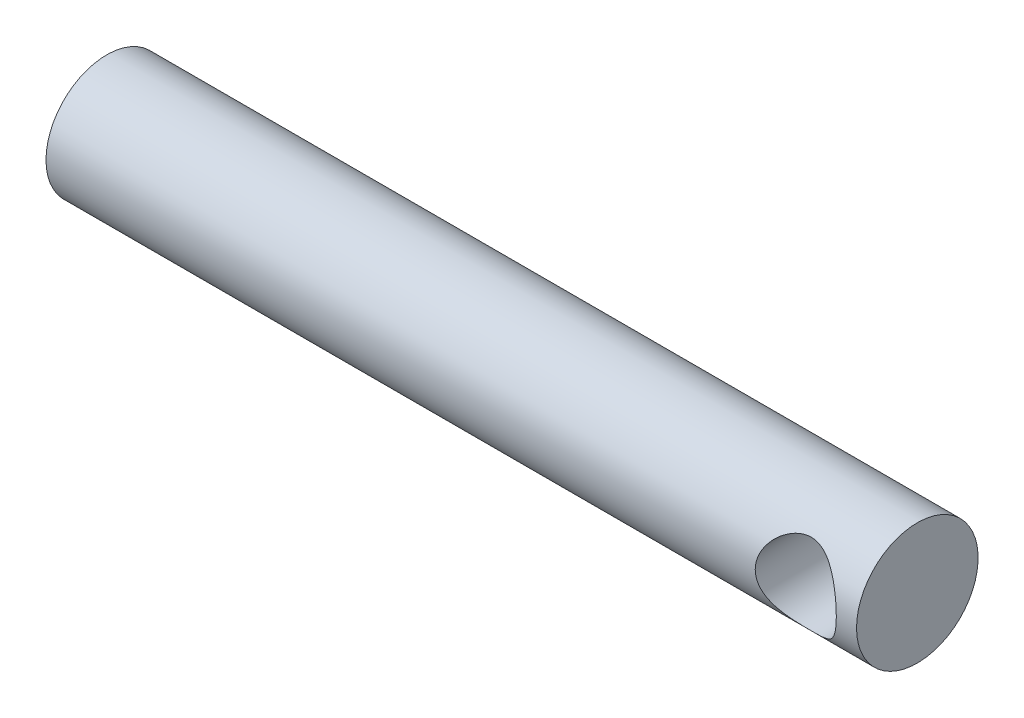
ISO-10303-21;
HEADER;
FILE_DESCRIPTION(('STEP AP214'),'2;1');
FILE_NAME('part.step','',(''),(''),'','','');
FILE_SCHEMA(('AUTOMOTIVE_DESIGN { 1 0 10303 214 1 1 1 1 }'));
ENDSEC;
DATA;
#1=APPLICATION_CONTEXT('core data for automotive mechanical design processes');
#2=APPLICATION_PROTOCOL_DEFINITION('international standard','automotive_design',2000,#1);
#3=PRODUCT_CONTEXT('',#1,'mechanical');
#4=PRODUCT('Part','Part','',(#3));
#5=PRODUCT_RELATED_PRODUCT_CATEGORY('part','',(#4));
#6=PRODUCT_DEFINITION_FORMATION('','',#4);
#7=PRODUCT_DEFINITION_CONTEXT('part definition',#1,'design');
#8=PRODUCT_DEFINITION('design','',#6,#7);
#9=PRODUCT_DEFINITION_SHAPE('','',#8);
#10=(LENGTH_UNIT() NAMED_UNIT(*) SI_UNIT(.MILLI.,.METRE.));
#11=(NAMED_UNIT(*) PLANE_ANGLE_UNIT() SI_UNIT($,.RADIAN.));
#12=(NAMED_UNIT(*) SI_UNIT($,.STERADIAN.) SOLID_ANGLE_UNIT());
#13=UNCERTAINTY_MEASURE_WITH_UNIT(LENGTH_MEASURE(1.E-05),#10,'distance_accuracy_value','');
#14=(GEOMETRIC_REPRESENTATION_CONTEXT(3) GLOBAL_UNCERTAINTY_ASSIGNED_CONTEXT((#13)) GLOBAL_UNIT_ASSIGNED_CONTEXT((#10,
#11,#12)) REPRESENTATION_CONTEXT('',''));
#15=CARTESIAN_POINT('',(0.,0.,0.));
#16=DIRECTION('',(0.,0.,1.));
#17=DIRECTION('',(1.,0.,0.));
#18=AXIS2_PLACEMENT_3D('',#15,#16,#17);
#19=CARTESIAN_POINT('',(-20.,0.,0.));
#20=DIRECTION('',(-1.,0.,0.));
#21=DIRECTION('',(0.,0.,1.));
#22=AXIS2_PLACEMENT_3D('',#19,#20,#21);
#23=CYLINDRICAL_SURFACE('',#22,3.);
#24=CARTESIAN_POINT('',(15.,0.,-3.));
#25=CARTESIAN_POINT('',(14.9999994503675,0.100484716668078,-3.0000004164484));
#26=CARTESIAN_POINT('',(15.0076139699555,0.200969087132902,-2.99490802753388));
#27=CARTESIAN_POINT('',(15.0375968641056,0.398733058031681,-2.97504652423809));
#28=CARTESIAN_POINT('',(15.0599722431233,0.496011113955008,-2.96027281581235));
#29=CARTESIAN_POINT('',(15.1181077173248,0.68421230785425,-2.92250482404708));
#30=CARTESIAN_POINT('',(15.1538051400079,0.775162872657556,-2.89954905493315));
#31=CARTESIAN_POINT('',(15.2370633632715,0.949415290997261,-2.8472613787744));
#32=CARTESIAN_POINT('',(15.2846258863005,1.03271603160967,-2.8179285460551));
#33=CARTESIAN_POINT('',(15.3946569373674,1.19728470077011,-2.75227329369838));
#34=CARTESIAN_POINT('',(15.4580478607429,1.27778030546068,-2.71556897579319));
#35=CARTESIAN_POINT('',(15.5957300486584,1.42772804469274,-2.63982313083466));
#36=CARTESIAN_POINT('',(15.6700369298377,1.49716405543888,-2.60077830356832));
#37=CARTESIAN_POINT('',(15.8410523676127,1.63422297745496,-2.51728264678794));
#38=CARTESIAN_POINT('',(15.9394456532034,1.6998318636275,-2.47295067937795));
#39=CARTESIAN_POINT('',(16.1483633776465,1.81350357014175,-2.3908414735282));
#40=CARTESIAN_POINT('',(16.2588664015627,1.86159673426503,-2.35305295954668));
#41=CARTESIAN_POINT('',(16.4567112934216,1.92674035011438,-2.2997626664146));
#42=CARTESIAN_POINT('',(16.5415284528739,1.94874447236008,-2.28097627892403));
#43=CARTESIAN_POINT('',(16.7147445047416,1.98150617785229,-2.25257969659604));
#44=CARTESIAN_POINT('',(16.803136948726,1.99228314651964,-2.24295368744147));
#45=CARTESIAN_POINT('',(16.9814747788564,2.00191364141228,-2.23436605608045));
#46=CARTESIAN_POINT('',(17.0714250234524,2.00071842917524,-2.23544802558502));
#47=CARTESIAN_POINT('',(17.2496349734997,1.98637581333356,-2.24819775483425));
#48=CARTESIAN_POINT('',(17.3378931820281,1.97321828380393,-2.25987448286881));
#49=CARTESIAN_POINT('',(17.5064670512419,1.93664994217326,-2.29127185989959));
#50=CARTESIAN_POINT('',(17.5869613359387,1.91371711479477,-2.31061488324375));
#51=CARTESIAN_POINT('',(17.7430236909758,1.85870118583424,-2.35509622933623));
#52=CARTESIAN_POINT('',(17.8185901302386,1.82661507328551,-2.3802364585489));
#53=CARTESIAN_POINT('',(17.9790253953564,1.74673818732649,-2.43964196377947));
#54=CARTESIAN_POINT('',(18.0626599004831,1.69708052300445,-2.47472317740626));
#55=CARTESIAN_POINT('',(18.2213833952857,1.58668960438221,-2.54691537733438));
#56=CARTESIAN_POINT('',(18.2964616577621,1.52594268999614,-2.58402882709328));
#57=CARTESIAN_POINT('',(18.4525425456034,1.37981165322309,-2.66543343763724));
#58=CARTESIAN_POINT('',(18.5313340486827,1.29193938283656,-2.7095474472056));
#59=CARTESIAN_POINT('',(18.6731964945385,1.10200799908008,-2.79218100665211));
#60=CARTESIAN_POINT('',(18.736282145409,0.999962299343699,-2.83070577648042));
#61=CARTESIAN_POINT('',(18.8334777186228,0.804857827096533,-2.89145404090364));
#62=CARTESIAN_POINT('',(18.8708433633389,0.713957643371913,-2.9153926116554));
#63=CARTESIAN_POINT('',(18.9321049256253,0.526036043935484,-2.95507719030499));
#64=CARTESIAN_POINT('',(18.9560122271322,0.429019879001653,-2.97083012127543));
#65=CARTESIAN_POINT('',(18.989161165238,0.230985453172283,-2.99275882156808));
#66=CARTESIAN_POINT('',(18.9983394609382,0.12995181193416,-2.99889322461187));
#67=CARTESIAN_POINT('',(19.0012470885622,-0.0724415193893449,-3.00083114965147));
#68=CARTESIAN_POINT('',(18.9949775004888,-0.173801186186624,-2.99663539385634));
#69=CARTESIAN_POINT('',(18.968375944438,-0.366455717204238,-2.97899589424273));
#70=CARTESIAN_POINT('',(18.9490627022448,-0.457957444679192,-2.96622246390226));
#71=CARTESIAN_POINT('',(18.8984043139871,-0.6361163924274,-2.93318449284837));
#72=CARTESIAN_POINT('',(18.8670572490718,-0.722772837571133,-2.91291875746989));
#73=CARTESIAN_POINT('',(18.7913477029551,-0.894664750465997,-2.86496352529158));
#74=CARTESIAN_POINT('',(18.7463118459181,-0.979496184631421,-2.83689870135785));
#75=CARTESIAN_POINT('',(18.6455667100537,-1.14068302395729,-2.77601855611511));
#76=CARTESIAN_POINT('',(18.5898508394678,-1.21703314820091,-2.74320030403941));
#77=CARTESIAN_POINT('',(18.4593921318425,-1.37185445482324,-2.6695454665343));
#78=CARTESIAN_POINT('',(18.3830337399249,-1.44875187569565,-2.62826156800165));
#79=CARTESIAN_POINT('',(18.2188885700429,-1.58933968069449,-2.54571173085957));
#80=CARTESIAN_POINT('',(18.1310939608925,-1.6530209365723,-2.50444582417845));
#81=CARTESIAN_POINT('',(17.9528575872319,-1.76124776549314,-2.4293967897058));
#82=CARTESIAN_POINT('',(17.8632679665378,-1.80695636125283,-2.39527597025701));
#83=CARTESIAN_POINT('',(17.6761273475563,-1.88496213740264,-2.33438974266154));
#84=CARTESIAN_POINT('',(17.5785910616954,-1.91728345682189,-2.30761112529822));
#85=CARTESIAN_POINT('',(17.3954355128046,-1.9623584346534,-2.26933208182632));
#86=CARTESIAN_POINT('',(17.310828190124,-1.97758597566225,-2.25594998021257));
#87=CARTESIAN_POINT('',(17.1394267186816,-1.99699205923373,-2.23879466438398));
#88=CARTESIAN_POINT('',(17.0526350488605,-2.00118260285317,-2.23501101347816));
#89=CARTESIAN_POINT('',(16.8793569432763,-1.99823921981267,-2.23764201149981));
#90=CARTESIAN_POINT('',(16.7928707186262,-1.99109858767784,-2.24406269907463));
#91=CARTESIAN_POINT('',(16.6226564714679,-1.96596997224746,-2.26610452403491));
#92=CARTESIAN_POINT('',(16.5389322861757,-1.94796751728258,-2.28173793527615));
#93=CARTESIAN_POINT('',(16.3542888135187,-1.89593035657494,-2.325268439048));
#94=CARTESIAN_POINT('',(16.2547322870567,-1.85890187130765,-2.35532333574982));
#95=CARTESIAN_POINT('',(16.0645131656158,-1.77084526236221,-2.42222161121309));
#96=CARTESIAN_POINT('',(15.9738633020083,-1.7197974834126,-2.45907449686699));
#97=CARTESIAN_POINT('',(15.8007181128637,-1.60398280555153,-2.53617186577119));
#98=CARTESIAN_POINT('',(15.7184012545769,-1.53898309894021,-2.5764658739228));
#99=CARTESIAN_POINT('',(15.5646775217421,-1.39671768031095,-2.65628301537844));
#100=CARTESIAN_POINT('',(15.4932740029708,-1.31944821025749,-2.69580590832396));
#101=CARTESIAN_POINT('',(15.3532878956909,-1.14145732976975,-2.77631551964082));
#102=CARTESIAN_POINT('',(15.2865813598217,-1.03896166955575,-2.81669805449991));
#103=CARTESIAN_POINT('',(15.1720867233347,-0.820868555771222,-2.88777665874161));
#104=CARTESIAN_POINT('',(15.124268893176,-0.705292062449162,-2.91848793445255));
#105=CARTESIAN_POINT('',(15.0588454218362,-0.491435069835749,-2.96101644836895));
#106=CARTESIAN_POINT('',(15.0368889609014,-0.395012325257924,-2.97551480368935));
#107=CARTESIAN_POINT('',(15.0074719674619,-0.199058012023947,-2.99500280141853));
#108=CARTESIAN_POINT('',(15.000000544404,-0.0995288361880083,-2.99999958751315));
#109=CARTESIAN_POINT('',(15.,0.,-3.));
#110=B_SPLINE_CURVE_WITH_KNOTS('',3,(#24,#25,#26,#27,#28,#29,#30,#31,#32,#33,#34,#35,#36,#37,
#38,#39,#40,#41,#42,#43,#44,#45,#46,#47,#48,#49,#50,#51,#52,#53,#54,#55,#56,#57,#58,#59,#60,#61,
#62,#63,#64,#65,#66,#67,#68,#69,#70,#71,#72,#73,#74,#75,#76,#77,#78,#79,#80,#81,#82,#83,#84,#85,
#86,#87,#88,#89,#90,#91,#92,#93,#94,#95,#96,#97,#98,#99,#100,#101,#102,#103,#104,#105,#106,#107,
#108,#109),.UNSPECIFIED.,.T.,.F.,(4,2,2,2,2,2,2,2,2,2,2,2,2,2,2,2,2,2,2,2,2,2,2,2,2,2,2,2,2,2,2,
2,2,2,2,2,2,2,2,2,2,2,4),(0.,0.3010532265054,0.602249414348689,0.902046153190234,
1.20188643867387,1.52717029000557,1.85292411604319,2.23006683295983,2.60655305445439,
2.87433693676029,3.1416576784581,3.41006711735378,3.67870397263353,3.93548862198023,
4.19235783805079,4.50147574660874,4.81097703780058,5.18718954496753,5.56304840301363,
5.86524087696759,6.16717735142814,6.47040883294251,6.77361911533416,7.05553084792473,
7.33748755138271,7.63652346829517,7.93574454945205,8.28228176141293,8.62905753175759,
8.94649935304477,9.26336626640724,9.52324048016136,9.78283200333092,10.0425772028455,
10.302669238524,10.6320660870419,10.9619271337795,11.2977924520448,11.6337608397015,
12.0179535155883,12.4015390656083,12.6999529136675,12.9981423125957),.UNSPECIFIED.);
#111=CARTESIAN_POINT('',(15.,0.,-3.));
#112=VERTEX_POINT('',#111);
#113=EDGE_CURVE('E47',#112,#112,#110,.T.);
#114=ORIENTED_EDGE('',*,*,#113,.F.);
#115=EDGE_LOOP('',(#114));
#116=FACE_BOUND('',#115,.T.);
#117=CARTESIAN_POINT('',(-20.,0.,0.));
#118=DIRECTION('',(-1.,0.,0.));
#119=DIRECTION('',(0.,0.,1.));
#120=AXIS2_PLACEMENT_3D('',#117,#118,#119);
#121=CIRCLE('',#120,3.);
#122=CARTESIAN_POINT('',(-20.,0.,3.));
#123=VERTEX_POINT('',#122);
#124=EDGE_CURVE('E10',#123,#123,#121,.T.);
#125=ORIENTED_EDGE('',*,*,#124,.F.);
#126=EDGE_LOOP('',(#125));
#127=FACE_BOUND('',#126,.T.);
#128=CARTESIAN_POINT('',(20.,0.,0.));
#129=DIRECTION('',(-1.,0.,0.));
#130=DIRECTION('',(0.,0.,1.));
#131=AXIS2_PLACEMENT_3D('',#128,#129,#130);
#132=CIRCLE('',#131,3.);
#133=CARTESIAN_POINT('',(20.,0.,3.));
#134=VERTEX_POINT('',#133);
#135=EDGE_CURVE('E41',#134,#134,#132,.T.);
#136=ORIENTED_EDGE('',*,*,#135,.T.);
#137=EDGE_LOOP('',(#136));
#138=FACE_BOUND('',#137,.T.);
#139=CARTESIAN_POINT('',(19.,0.,3.));
#140=CARTESIAN_POINT('',(19.0000005496324,0.100484716668078,3.0000004164484));
#141=CARTESIAN_POINT('',(18.9923860300445,0.200969087132902,2.99490802753388));
#142=CARTESIAN_POINT('',(18.9624031358943,0.398733058031682,2.97504652423809));
#143=CARTESIAN_POINT('',(18.9400277568767,0.496011113955007,2.96027281581235));
#144=CARTESIAN_POINT('',(18.8818922826751,0.684212307854249,2.92250482404708));
#145=CARTESIAN_POINT('',(18.846194859992,0.775162872657554,2.89954905493315));
#146=CARTESIAN_POINT('',(18.7629366367285,0.94941529099726,2.8472613787744));
#147=CARTESIAN_POINT('',(18.7153741136994,1.03271603160967,2.8179285460551));
#148=CARTESIAN_POINT('',(18.6053430626325,1.19728470077011,2.75227329369838));
#149=CARTESIAN_POINT('',(18.5419521392571,1.27778030546067,2.71556897579319));
#150=CARTESIAN_POINT('',(18.4042699513415,1.42772804469274,2.63982313083466));
#151=CARTESIAN_POINT('',(18.3299630701622,1.49716405543888,2.60077830356832));
#152=CARTESIAN_POINT('',(18.1589476323873,1.63422297745496,2.51728264678794));
#153=CARTESIAN_POINT('',(18.0605543467965,1.6998318636275,2.47295067937795));
#154=CARTESIAN_POINT('',(17.8516366223534,1.81350357014175,2.3908414735282));
#155=CARTESIAN_POINT('',(17.7411335984372,1.86159673426503,2.35305295954667));
#156=CARTESIAN_POINT('',(17.5432887065784,1.92674035011438,2.2997626664146));
#157=CARTESIAN_POINT('',(17.4584715471261,1.94874447236008,2.28097627892403));
#158=CARTESIAN_POINT('',(17.2852554952583,1.98150617785229,2.25257969659604));
#159=CARTESIAN_POINT('',(17.1968630512739,1.99228314651964,2.24295368744147));
#160=CARTESIAN_POINT('',(17.0185252211435,2.00191364141228,2.23436605608045));
#161=CARTESIAN_POINT('',(16.9285749765476,2.00071842917524,2.23544802558502));
#162=CARTESIAN_POINT('',(16.7503650265002,1.98637581333356,2.24819775483425));
#163=CARTESIAN_POINT('',(16.6621068179718,1.97321828380393,2.25987448286881));
#164=CARTESIAN_POINT('',(16.4935329487581,1.93664994217326,2.29127185989959));
#165=CARTESIAN_POINT('',(16.4130386640612,1.91371711479477,2.31061488324375));
#166=CARTESIAN_POINT('',(16.2569763090242,1.85870118583424,2.35509622933623));
#167=CARTESIAN_POINT('',(16.1814098697613,1.82661507328551,2.3802364585489));
#168=CARTESIAN_POINT('',(16.0209746046435,1.74673818732649,2.43964196377947));
#169=CARTESIAN_POINT('',(15.9373400995169,1.69708052300445,2.47472317740626));
#170=CARTESIAN_POINT('',(15.7786166047142,1.58668960438221,2.54691537733438));
#171=CARTESIAN_POINT('',(15.7035383422379,1.52594268999614,2.58402882709328));
#172=CARTESIAN_POINT('',(15.5474574543966,1.37981165322309,2.66543343763724));
#173=CARTESIAN_POINT('',(15.4686659513172,1.29193938283656,2.7095474472056));
#174=CARTESIAN_POINT('',(15.3268035054615,1.10200799908008,2.79218100665212));
#175=CARTESIAN_POINT('',(15.263717854591,0.999962299343698,2.83070577648042));
#176=CARTESIAN_POINT('',(15.1665222813771,0.80485782709653,2.89145404090364));
#177=CARTESIAN_POINT('',(15.129156636661,0.713957643371909,2.9153926116554));
#178=CARTESIAN_POINT('',(15.0678950743746,0.52603604393548,2.95507719030499));
#179=CARTESIAN_POINT('',(15.0439877728678,0.429019879001649,2.97083012127544));
#180=CARTESIAN_POINT('',(15.010838834762,0.23098545317228,2.99275882156808));
#181=CARTESIAN_POINT('',(15.0016605390617,0.129951811934157,2.99889322461187));
#182=CARTESIAN_POINT('',(14.9987529114378,-0.072441519389348,3.00083114965147));
#183=CARTESIAN_POINT('',(15.0050224995112,-0.173801186186627,2.99663539385634));
#184=CARTESIAN_POINT('',(15.0316240555619,-0.366455717204241,2.97899589424273));
#185=CARTESIAN_POINT('',(15.0509372977552,-0.457957444679195,2.96622246390226));
#186=CARTESIAN_POINT('',(15.1015956860128,-0.636116392427403,2.93318449284837));
#187=CARTESIAN_POINT('',(15.1329427509282,-0.722772837571136,2.91291875746989));
#188=CARTESIAN_POINT('',(15.2086522970449,-0.894664750465999,2.86496352529158));
#189=CARTESIAN_POINT('',(15.2536881540818,-0.979496184631422,2.83689870135785));
#190=CARTESIAN_POINT('',(15.3544332899463,-1.14068302395729,2.77601855611511));
#191=CARTESIAN_POINT('',(15.4101491605321,-1.21703314820091,2.74320030403941));
#192=CARTESIAN_POINT('',(15.5406078681575,-1.37185445482324,2.6695454665343));
#193=CARTESIAN_POINT('',(15.6169662600751,-1.44875187569565,2.62826156800165));
#194=CARTESIAN_POINT('',(15.7811114299571,-1.58933968069449,2.54571173085957));
#195=CARTESIAN_POINT('',(15.8689060391075,-1.6530209365723,2.50444582417845));
#196=CARTESIAN_POINT('',(16.0471424127681,-1.76124776549314,2.4293967897058));
#197=CARTESIAN_POINT('',(16.1367320334622,-1.80695636125284,2.39527597025701));
#198=CARTESIAN_POINT('',(16.3238726524436,-1.88496213740265,2.33438974266154));
#199=CARTESIAN_POINT('',(16.4214089383046,-1.9172834568219,2.30761112529821));
#200=CARTESIAN_POINT('',(16.6045644871954,-1.9623584346534,2.26933208182632));
#201=CARTESIAN_POINT('',(16.689171809876,-1.97758597566225,2.25594998021257));
#202=CARTESIAN_POINT('',(16.8605732813184,-1.99699205923373,2.23879466438398));
#203=CARTESIAN_POINT('',(16.9473649511395,-2.00118260285317,2.23501101347816));
#204=CARTESIAN_POINT('',(17.1206430567237,-1.99823921981266,2.23764201149981));
#205=CARTESIAN_POINT('',(17.2071292813737,-1.99109858767784,2.24406269907463));
#206=CARTESIAN_POINT('',(17.3773435285321,-1.96596997224746,2.26610452403491));
#207=CARTESIAN_POINT('',(17.4610677138243,-1.94796751728258,2.28173793527615));
#208=CARTESIAN_POINT('',(17.6457111864812,-1.89593035657494,2.325268439048));
#209=CARTESIAN_POINT('',(17.7452677129433,-1.85890187130765,2.35532333574982));
#210=CARTESIAN_POINT('',(17.9354868343842,-1.77084526236221,2.42222161121309));
#211=CARTESIAN_POINT('',(18.0261366979917,-1.71979748341259,2.45907449686699));
#212=CARTESIAN_POINT('',(18.1992818871362,-1.60398280555153,2.53617186577119));
#213=CARTESIAN_POINT('',(18.281598745423,-1.53898309894021,2.5764658739228));
#214=CARTESIAN_POINT('',(18.4353224782579,-1.39671768031094,2.65628301537844));
#215=CARTESIAN_POINT('',(18.5067259970292,-1.31944821025748,2.69580590832396));
#216=CARTESIAN_POINT('',(18.6467121043091,-1.14145732976974,2.77631551964082));
#217=CARTESIAN_POINT('',(18.7134186401783,-1.03896166955574,2.81669805449991));
#218=CARTESIAN_POINT('',(18.8279132766653,-0.820868555771214,2.88777665874161));
#219=CARTESIAN_POINT('',(18.8757311068239,-0.705292062449153,2.91848793445255));
#220=CARTESIAN_POINT('',(18.9411545781638,-0.491435069835743,2.96101644836895));
#221=CARTESIAN_POINT('',(18.9631110390986,-0.395012325257919,2.97551480368935));
#222=CARTESIAN_POINT('',(18.9925280325381,-0.199058012023945,2.99500280141853));
#223=CARTESIAN_POINT('',(18.999999455596,-0.0995288361880073,2.99999958751315));
#224=CARTESIAN_POINT('',(19.,0.,3.));
#225=B_SPLINE_CURVE_WITH_KNOTS('',3,(#139,#140,#141,#142,#143,#144,#145,#146,#147,#148,#149,
#150,#151,#152,#153,#154,#155,#156,#157,#158,#159,#160,#161,#162,#163,#164,#165,#166,#167,#168,
#169,#170,#171,#172,#173,#174,#175,#176,#177,#178,#179,#180,#181,#182,#183,#184,#185,#186,#187,
#188,#189,#190,#191,#192,#193,#194,#195,#196,#197,#198,#199,#200,#201,#202,#203,#204,#205,#206,
#207,#208,#209,#210,#211,#212,#213,#214,#215,#216,#217,#218,#219,#220,#221,#222,#223,#224),
.UNSPECIFIED.,.T.,.F.,(4,2,2,2,2,2,2,2,2,2,2,2,2,2,2,2,2,2,2,2,2,2,2,2,2,2,2,2,2,2,2,2,2,2,2,2,
2,2,2,2,2,2,4),(0.,0.3010532265054,0.602249414348688,0.902046153190232,1.20188643867387,
1.52717029000557,1.85292411604319,2.23006683295983,2.60655305445439,2.87433693676029,
3.1416576784581,3.41006711735378,3.67870397263353,3.93548862198023,4.1923578380508,
4.50147574660875,4.81097703780058,5.18718954496753,5.56304840301364,5.86524087696759,
6.16717735142814,6.47040883294252,6.77361911533416,7.05553084792474,7.33748755138272,
7.63652346829518,7.93574454945205,8.28228176141293,8.6290575317576,8.94649935304478,
9.26336626640725,9.52324048016137,9.78283200333093,10.0425772028455,10.302669238524,
10.6320660870419,10.9619271337795,11.2977924520449,11.6337608397015,12.0179535155883,
12.4015390656083,12.6999529136675,12.9981423125957),.UNSPECIFIED.);
#226=CARTESIAN_POINT('',(19.,0.,3.));
#227=VERTEX_POINT('',#226);
#228=EDGE_CURVE('E33',#227,#227,#225,.T.);
#229=ORIENTED_EDGE('',*,*,#228,.F.);
#230=EDGE_LOOP('',(#229));
#231=FACE_BOUND('',#230,.T.);
#232=ADVANCED_FACE('F29',(#116,#127,#138,#231),#23,.T.);
#233=CARTESIAN_POINT('',(20.,0.,0.));
#234=DIRECTION('',(-1.,0.,0.));
#235=DIRECTION('',(0.,0.,1.));
#236=AXIS2_PLACEMENT_3D('',#233,#234,#235);
#237=PLANE('',#236);
#238=ORIENTED_EDGE('',*,*,#135,.F.);
#239=EDGE_LOOP('',(#238));
#240=FACE_BOUND('',#239,.T.);
#241=ADVANCED_FACE('F31',(#240),#237,.F.);
#242=CARTESIAN_POINT('',(-20.,0.,0.));
#243=DIRECTION('',(1.,0.,0.));
#244=DIRECTION('',(0.,0.,-1.));
#245=AXIS2_PLACEMENT_3D('',#242,#243,#244);
#246=PLANE('',#245);
#247=ORIENTED_EDGE('',*,*,#124,.T.);
#248=EDGE_LOOP('',(#247));
#249=FACE_BOUND('',#248,.T.);
#250=ADVANCED_FACE('F55',(#249),#246,.F.);
#251=CARTESIAN_POINT('',(17.,0.,10.));
#252=DIRECTION('',(0.,0.,-1.));
#253=DIRECTION('',(-1.,0.,0.));
#254=AXIS2_PLACEMENT_3D('',#251,#252,#253);
#255=CYLINDRICAL_SURFACE('',#254,2.);
#256=ORIENTED_EDGE('',*,*,#113,.T.);
#257=EDGE_LOOP('',(#256));
#258=FACE_BOUND('',#257,.T.);
#259=ORIENTED_EDGE('',*,*,#228,.T.);
#260=EDGE_LOOP('',(#259));
#261=FACE_BOUND('',#260,.T.);
#262=ADVANCED_FACE('F52',(#258,#261),#255,.F.);
#263=CLOSED_SHELL('',(#232,#241,#250,#262));
#264=MANIFOLD_SOLID_BREP('B2',#263);
#265=ADVANCED_BREP_SHAPE_REPRESENTATION('',(#18,#264),#14);
#266=SHAPE_DEFINITION_REPRESENTATION(#9,#265);
ENDSEC;
END-ISO-10303-21;
